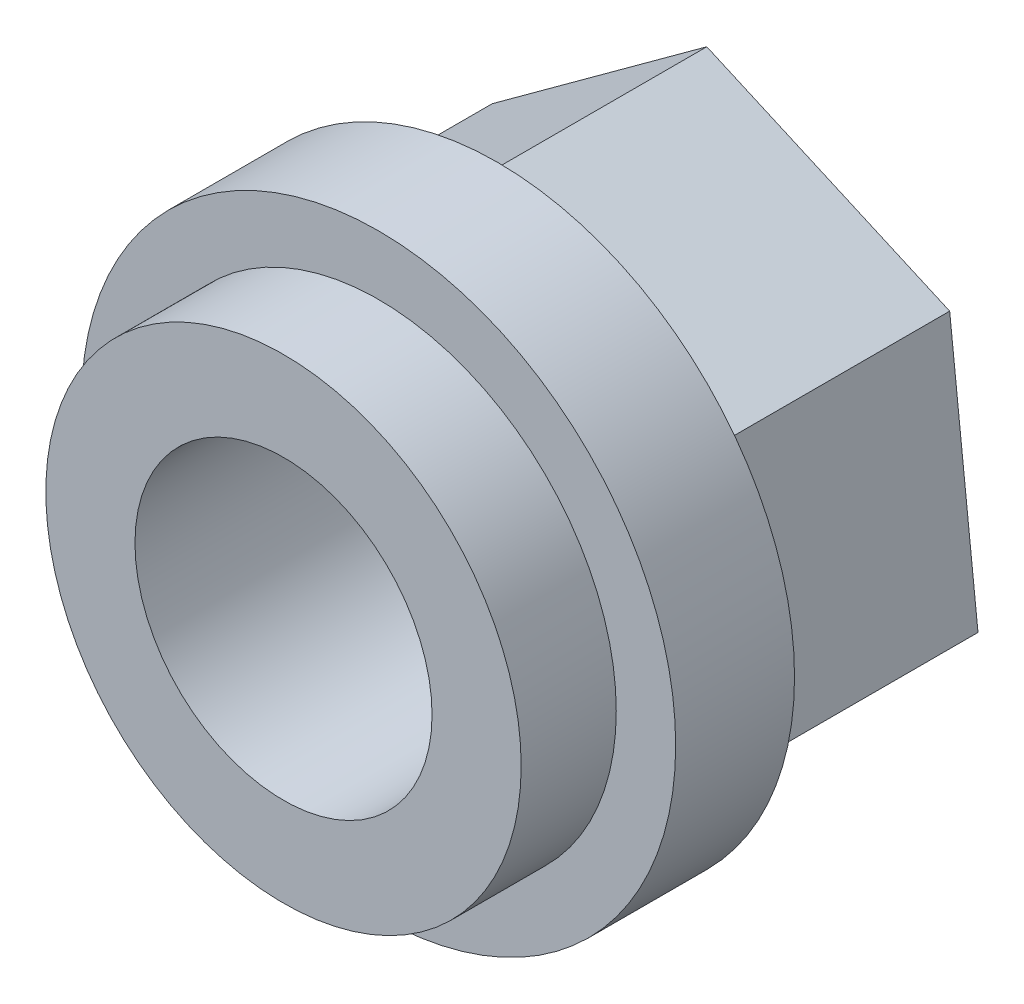
ISO-10303-21;
HEADER;
FILE_DESCRIPTION(('STEP AP214'),'2;1');
FILE_NAME('part.step','',(''),(''),'','','');
FILE_SCHEMA(('AUTOMOTIVE_DESIGN { 1 0 10303 214 1 1 1 1 }'));
ENDSEC;
DATA;
#1=APPLICATION_CONTEXT('core data for automotive mechanical design processes');
#2=APPLICATION_PROTOCOL_DEFINITION('international standard','automotive_design',2000,#1);
#3=PRODUCT_CONTEXT('',#1,'mechanical');
#4=PRODUCT('Part','Part','',(#3));
#5=PRODUCT_RELATED_PRODUCT_CATEGORY('part','',(#4));
#6=PRODUCT_DEFINITION_FORMATION('','',#4);
#7=PRODUCT_DEFINITION_CONTEXT('part definition',#1,'design');
#8=PRODUCT_DEFINITION('design','',#6,#7);
#9=PRODUCT_DEFINITION_SHAPE('','',#8);
#10=(LENGTH_UNIT() NAMED_UNIT(*) SI_UNIT(.MILLI.,.METRE.));
#11=(NAMED_UNIT(*) PLANE_ANGLE_UNIT() SI_UNIT($,.RADIAN.));
#12=(NAMED_UNIT(*) SI_UNIT($,.STERADIAN.) SOLID_ANGLE_UNIT());
#13=UNCERTAINTY_MEASURE_WITH_UNIT(LENGTH_MEASURE(1.E-05),#10,'distance_accuracy_value','');
#14=(GEOMETRIC_REPRESENTATION_CONTEXT(3) GLOBAL_UNCERTAINTY_ASSIGNED_CONTEXT((#13)) GLOBAL_UNIT_ASSIGNED_CONTEXT((#10,
#11,#12)) REPRESENTATION_CONTEXT('',''));
#15=CARTESIAN_POINT('',(0.,0.,0.));
#16=DIRECTION('',(0.,0.,1.));
#17=DIRECTION('',(1.,0.,0.));
#18=AXIS2_PLACEMENT_3D('',#15,#16,#17);
#19=CARTESIAN_POINT('',(0.,0.,0.));
#20=DIRECTION('',(0.,0.,1.));
#21=DIRECTION('',(1.,0.,0.));
#22=AXIS2_PLACEMENT_3D('',#19,#20,#21);
#23=PLANE('',#22);
#24=CARTESIAN_POINT('',(0.,0.,0.));
#25=DIRECTION('',(0.,0.,1.));
#26=DIRECTION('',(1.,0.,0.));
#27=AXIS2_PLACEMENT_3D('',#24,#25,#26);
#28=CIRCLE('',#27,25.);
#29=CARTESIAN_POINT('',(25.,0.,0.));
#30=VERTEX_POINT('',#29);
#31=EDGE_CURVE('E46',#30,#30,#28,.T.);
#32=ORIENTED_EDGE('',*,*,#31,.F.);
#33=EDGE_LOOP('',(#32));
#34=FACE_BOUND('',#33,.T.);
#35=DIRECTION('',(0.106649643438628,-0.994296662749309,0.));
#36=VECTOR('',#35,1.);
#37=CARTESIAN_POINT('',(18.0534867210994,13.175555316386,0.));
#38=LINE('',#37,#36);
#39=CARTESIAN_POINT('',(18.0534867210994,13.175555316386,0.));
#40=VERTEX_POINT('',#39);
#41=CARTESIAN_POINT('',(20.4371089735071,-9.04700046916413,0.));
#42=VERTEX_POINT('',#41);
#43=EDGE_CURVE('E59',#40,#42,#38,.T.);
#44=ORIENTED_EDGE('',*,*,#43,.F.);
#45=DIRECTION('',(0.914410990558305,-0.40478703085225,0.));
#46=VECTOR('',#45,1.);
#47=CARTESIAN_POINT('',(-2.38362225240768,22.2225557855501,0.));
#48=LINE('',#47,#46);
#49=CARTESIAN_POINT('',(-2.38362225240768,22.2225557855501,0.));
#50=VERTEX_POINT('',#49);
#51=EDGE_CURVE('E63',#50,#40,#48,.T.);
#52=ORIENTED_EDGE('',*,*,#51,.F.);
#53=DIRECTION('',(0.807761347119676,0.589509631897059,0.));
#54=VECTOR('',#53,1.);
#55=CARTESIAN_POINT('',(-20.4371089735071,9.04700046916413,0.));
#56=LINE('',#55,#54);
#57=CARTESIAN_POINT('',(-20.4371089735071,9.04700046916413,0.));
#58=VERTEX_POINT('',#57);
#59=EDGE_CURVE('E203',#58,#50,#56,.T.);
#60=ORIENTED_EDGE('',*,*,#59,.F.);
#61=DIRECTION('',(-0.106649643438628,0.994296662749309,0.));
#62=VECTOR('',#61,1.);
#63=CARTESIAN_POINT('',(-18.0534867210994,-13.175555316386,0.));
#64=LINE('',#63,#62);
#65=CARTESIAN_POINT('',(-18.0534867210994,-13.175555316386,0.));
#66=VERTEX_POINT('',#65);
#67=EDGE_CURVE('E200',#66,#58,#64,.T.);
#68=ORIENTED_EDGE('',*,*,#67,.F.);
#69=DIRECTION('',(-0.914410990558305,0.40478703085225,0.));
#70=VECTOR('',#69,1.);
#71=CARTESIAN_POINT('',(2.38362225240767,-22.2225557855501,0.));
#72=LINE('',#71,#70);
#73=CARTESIAN_POINT('',(2.38362225240767,-22.2225557855501,0.));
#74=VERTEX_POINT('',#73);
#75=EDGE_CURVE('E197',#74,#66,#72,.T.);
#76=ORIENTED_EDGE('',*,*,#75,.F.);
#77=DIRECTION('',(-0.807761347119676,-0.589509631897059,0.));
#78=VECTOR('',#77,1.);
#79=CARTESIAN_POINT('',(20.4371089735071,-9.04700046916413,0.));
#80=LINE('',#79,#78);
#81=EDGE_CURVE('E195',#42,#74,#80,.T.);
#82=ORIENTED_EDGE('',*,*,#81,.F.);
#83=EDGE_LOOP('',(#44,#52,#60,#68,#76,#82));
#84=FACE_BOUND('',#83,.T.);
#85=ADVANCED_FACE('F42',(#34,#84),#23,.F.);
#86=CARTESIAN_POINT('',(0.,0.,10.));
#87=DIRECTION('',(0.,0.,-1.));
#88=DIRECTION('',(-1.,0.,0.));
#89=AXIS2_PLACEMENT_3D('',#86,#87,#88);
#90=CYLINDRICAL_SURFACE('',#89,25.);
#91=CARTESIAN_POINT('',(0.,0.,10.));
#92=DIRECTION('',(0.,0.,1.));
#93=DIRECTION('',(1.,0.,0.));
#94=AXIS2_PLACEMENT_3D('',#91,#92,#93);
#95=CIRCLE('',#94,25.);
#96=CARTESIAN_POINT('',(25.,0.,10.));
#97=VERTEX_POINT('',#96);
#98=EDGE_CURVE('E51',#97,#97,#95,.T.);
#99=ORIENTED_EDGE('',*,*,#98,.F.);
#100=EDGE_LOOP('',(#99));
#101=FACE_BOUND('',#100,.T.);
#102=ORIENTED_EDGE('',*,*,#31,.T.);
#103=EDGE_LOOP('',(#102));
#104=FACE_BOUND('',#103,.T.);
#105=ADVANCED_FACE('F44',(#101,#104),#90,.T.);
#106=CARTESIAN_POINT('',(0.,0.,10.));
#107=DIRECTION('',(0.,0.,1.));
#108=DIRECTION('',(1.,0.,0.));
#109=AXIS2_PLACEMENT_3D('',#106,#107,#108);
#110=PLANE('',#109);
#111=CARTESIAN_POINT('',(0.,0.,10.));
#112=DIRECTION('',(0.,0.,1.));
#113=DIRECTION('',(1.,0.,0.));
#114=AXIS2_PLACEMENT_3D('',#111,#112,#113);
#115=CIRCLE('',#114,20.);
#116=CARTESIAN_POINT('',(20.,0.,10.));
#117=VERTEX_POINT('',#116);
#118=EDGE_CURVE('E11',#117,#117,#115,.T.);
#119=ORIENTED_EDGE('',*,*,#118,.F.);
#120=EDGE_LOOP('',(#119));
#121=FACE_BOUND('',#120,.T.);
#122=ORIENTED_EDGE('',*,*,#98,.T.);
#123=EDGE_LOOP('',(#122));
#124=FACE_BOUND('',#123,.T.);
#125=ADVANCED_FACE('F135',(#121,#124),#110,.T.);
#126=CARTESIAN_POINT('',(0.,0.,18.));
#127=DIRECTION('',(0.,0.,-1.));
#128=DIRECTION('',(-1.,0.,0.));
#129=AXIS2_PLACEMENT_3D('',#126,#127,#128);
#130=CYLINDRICAL_SURFACE('',#129,20.);
#131=CARTESIAN_POINT('',(0.,0.,18.));
#132=DIRECTION('',(0.,0.,1.));
#133=DIRECTION('',(1.,0.,0.));
#134=AXIS2_PLACEMENT_3D('',#131,#132,#133);
#135=CIRCLE('',#134,20.);
#136=CARTESIAN_POINT('',(20.,0.,18.));
#137=VERTEX_POINT('',#136);
#138=EDGE_CURVE('E117',#137,#137,#135,.T.);
#139=ORIENTED_EDGE('',*,*,#138,.F.);
#140=EDGE_LOOP('',(#139));
#141=FACE_BOUND('',#140,.T.);
#142=ORIENTED_EDGE('',*,*,#118,.T.);
#143=EDGE_LOOP('',(#142));
#144=FACE_BOUND('',#143,.T.);
#145=ADVANCED_FACE('F140',(#141,#144),#130,.T.);
#146=CARTESIAN_POINT('',(0.,0.,18.));
#147=DIRECTION('',(0.,0.,1.));
#148=DIRECTION('',(1.,0.,0.));
#149=AXIS2_PLACEMENT_3D('',#146,#147,#148);
#150=PLANE('',#149);
#151=CARTESIAN_POINT('',(0.,0.,18.));
#152=DIRECTION('',(0.,0.,-1.));
#153=DIRECTION('',(-1.,0.,0.));
#154=AXIS2_PLACEMENT_3D('',#151,#152,#153);
#155=CIRCLE('',#154,12.5);
#156=CARTESIAN_POINT('',(-12.5,0.,18.));
#157=VERTEX_POINT('',#156);
#158=EDGE_CURVE('E180',#157,#157,#155,.T.);
#159=ORIENTED_EDGE('',*,*,#158,.T.);
#160=EDGE_LOOP('',(#159));
#161=FACE_BOUND('',#160,.T.);
#162=ORIENTED_EDGE('',*,*,#138,.T.);
#163=EDGE_LOOP('',(#162));
#164=FACE_BOUND('',#163,.T.);
#165=ADVANCED_FACE('F144',(#161,#164),#150,.T.);
#166=CARTESIAN_POINT('',(18.0534867210994,13.175555316386,-20.));
#167=DIRECTION('',(-0.994296662749309,-0.106649643438628,0.));
#168=DIRECTION('',(0.106649643438628,-0.994296662749309,0.));
#169=AXIS2_PLACEMENT_3D('',#166,#167,#168);
#170=PLANE('',#169);
#171=ORIENTED_EDGE('',*,*,#43,.T.);
#172=DIRECTION('',(0.,0.,1.));
#173=VECTOR('',#172,1.);
#174=CARTESIAN_POINT('',(20.4371089735071,-9.04700046916413,-20.));
#175=LINE('',#174,#173);
#176=CARTESIAN_POINT('',(20.4371089735071,-9.04700046916413,-20.));
#177=VERTEX_POINT('',#176);
#178=EDGE_CURVE('E100',#177,#42,#175,.T.);
#179=ORIENTED_EDGE('',*,*,#178,.F.);
#180=DIRECTION('',(0.106649643438628,-0.994296662749309,0.));
#181=VECTOR('',#180,1.);
#182=CARTESIAN_POINT('',(18.0534867210994,13.175555316386,-20.));
#183=LINE('',#182,#181);
#184=CARTESIAN_POINT('',(18.0534867210994,13.175555316386,-20.));
#185=VERTEX_POINT('',#184);
#186=EDGE_CURVE('E106',#185,#177,#183,.T.);
#187=ORIENTED_EDGE('',*,*,#186,.F.);
#188=DIRECTION('',(0.,0.,1.));
#189=VECTOR('',#188,1.);
#190=CARTESIAN_POINT('',(18.0534867210994,13.175555316386,-20.));
#191=LINE('',#190,#189);
#192=EDGE_CURVE('E193',#185,#40,#191,.T.);
#193=ORIENTED_EDGE('',*,*,#192,.T.);
#194=EDGE_LOOP('',(#171,#179,#187,#193));
#195=FACE_BOUND('',#194,.T.);
#196=ADVANCED_FACE('F116',(#195),#170,.F.);
#197=CARTESIAN_POINT('',(20.4371089735071,-9.04700046916413,-20.));
#198=DIRECTION('',(-0.589509631897059,0.807761347119676,0.));
#199=DIRECTION('',(-0.807761347119676,-0.589509631897059,0.));
#200=AXIS2_PLACEMENT_3D('',#197,#198,#199);
#201=PLANE('',#200);
#202=ORIENTED_EDGE('',*,*,#81,.T.);
#203=DIRECTION('',(0.,0.,1.));
#204=VECTOR('',#203,1.);
#205=CARTESIAN_POINT('',(2.38362225240767,-22.2225557855501,-20.));
#206=LINE('',#205,#204);
#207=CARTESIAN_POINT('',(2.38362225240767,-22.2225557855501,-20.));
#208=VERTEX_POINT('',#207);
#209=EDGE_CURVE('E102',#208,#74,#206,.T.);
#210=ORIENTED_EDGE('',*,*,#209,.F.);
#211=DIRECTION('',(-0.807761347119676,-0.589509631897059,0.));
#212=VECTOR('',#211,1.);
#213=CARTESIAN_POINT('',(20.4371089735071,-9.04700046916413,-20.));
#214=LINE('',#213,#212);
#215=EDGE_CURVE('E95',#177,#208,#214,.T.);
#216=ORIENTED_EDGE('',*,*,#215,.F.);
#217=ORIENTED_EDGE('',*,*,#178,.T.);
#218=EDGE_LOOP('',(#202,#210,#216,#217));
#219=FACE_BOUND('',#218,.T.);
#220=ADVANCED_FACE('F98',(#219),#201,.F.);
#221=CARTESIAN_POINT('',(2.38362225240767,-22.2225557855501,-20.));
#222=DIRECTION('',(0.40478703085225,0.914410990558305,0.));
#223=DIRECTION('',(-0.914410990558305,0.40478703085225,0.));
#224=AXIS2_PLACEMENT_3D('',#221,#222,#223);
#225=PLANE('',#224);
#226=ORIENTED_EDGE('',*,*,#75,.T.);
#227=DIRECTION('',(0.,0.,1.));
#228=VECTOR('',#227,1.);
#229=CARTESIAN_POINT('',(-18.0534867210994,-13.175555316386,-20.));
#230=LINE('',#229,#228);
#231=CARTESIAN_POINT('',(-18.0534867210994,-13.175555316386,-20.));
#232=VERTEX_POINT('',#231);
#233=EDGE_CURVE('E121',#232,#66,#230,.T.);
#234=ORIENTED_EDGE('',*,*,#233,.F.);
#235=DIRECTION('',(-0.914410990558305,0.40478703085225,0.));
#236=VECTOR('',#235,1.);
#237=CARTESIAN_POINT('',(2.38362225240767,-22.2225557855501,-20.));
#238=LINE('',#237,#236);
#239=EDGE_CURVE('E105',#208,#232,#238,.T.);
#240=ORIENTED_EDGE('',*,*,#239,.F.);
#241=ORIENTED_EDGE('',*,*,#209,.T.);
#242=EDGE_LOOP('',(#226,#234,#240,#241));
#243=FACE_BOUND('',#242,.T.);
#244=ADVANCED_FACE('F153',(#243),#225,.F.);
#245=CARTESIAN_POINT('',(-18.0534867210994,-13.175555316386,-20.));
#246=DIRECTION('',(0.994296662749309,0.106649643438628,0.));
#247=DIRECTION('',(-0.106649643438628,0.994296662749309,0.));
#248=AXIS2_PLACEMENT_3D('',#245,#246,#247);
#249=PLANE('',#248);
#250=ORIENTED_EDGE('',*,*,#67,.T.);
#251=DIRECTION('',(0.,0.,1.));
#252=VECTOR('',#251,1.);
#253=CARTESIAN_POINT('',(-20.4371089735071,9.04700046916413,-20.));
#254=LINE('',#253,#252);
#255=CARTESIAN_POINT('',(-20.4371089735071,9.04700046916413,-20.));
#256=VERTEX_POINT('',#255);
#257=EDGE_CURVE('E210',#256,#58,#254,.T.);
#258=ORIENTED_EDGE('',*,*,#257,.F.);
#259=DIRECTION('',(-0.106649643438628,0.994296662749309,0.));
#260=VECTOR('',#259,1.);
#261=CARTESIAN_POINT('',(-18.0534867210994,-13.175555316386,-20.));
#262=LINE('',#261,#260);
#263=EDGE_CURVE('E188',#232,#256,#262,.T.);
#264=ORIENTED_EDGE('',*,*,#263,.F.);
#265=ORIENTED_EDGE('',*,*,#233,.T.);
#266=EDGE_LOOP('',(#250,#258,#264,#265));
#267=FACE_BOUND('',#266,.T.);
#268=ADVANCED_FACE('F156',(#267),#249,.F.);
#269=CARTESIAN_POINT('',(-20.4371089735071,9.04700046916413,-20.));
#270=DIRECTION('',(0.589509631897059,-0.807761347119676,0.));
#271=DIRECTION('',(0.807761347119676,0.589509631897059,0.));
#272=AXIS2_PLACEMENT_3D('',#269,#270,#271);
#273=PLANE('',#272);
#274=ORIENTED_EDGE('',*,*,#59,.T.);
#275=DIRECTION('',(0.,0.,1.));
#276=VECTOR('',#275,1.);
#277=CARTESIAN_POINT('',(-2.38362225240768,22.2225557855501,-20.));
#278=LINE('',#277,#276);
#279=CARTESIAN_POINT('',(-2.38362225240768,22.2225557855501,-20.));
#280=VERTEX_POINT('',#279);
#281=EDGE_CURVE('E207',#280,#50,#278,.T.);
#282=ORIENTED_EDGE('',*,*,#281,.F.);
#283=DIRECTION('',(0.807761347119676,0.589509631897059,0.));
#284=VECTOR('',#283,1.);
#285=CARTESIAN_POINT('',(-20.4371089735071,9.04700046916413,-20.));
#286=LINE('',#285,#284);
#287=EDGE_CURVE('E190',#256,#280,#286,.T.);
#288=ORIENTED_EDGE('',*,*,#287,.F.);
#289=ORIENTED_EDGE('',*,*,#257,.T.);
#290=EDGE_LOOP('',(#274,#282,#288,#289));
#291=FACE_BOUND('',#290,.T.);
#292=ADVANCED_FACE('F160',(#291),#273,.F.);
#293=CARTESIAN_POINT('',(-2.38362225240768,22.2225557855501,-20.));
#294=DIRECTION('',(-0.40478703085225,-0.914410990558305,0.));
#295=DIRECTION('',(0.914410990558305,-0.40478703085225,0.));
#296=AXIS2_PLACEMENT_3D('',#293,#294,#295);
#297=PLANE('',#296);
#298=ORIENTED_EDGE('',*,*,#51,.T.);
#299=ORIENTED_EDGE('',*,*,#192,.F.);
#300=DIRECTION('',(0.914410990558305,-0.40478703085225,0.));
#301=VECTOR('',#300,1.);
#302=CARTESIAN_POINT('',(-2.38362225240768,22.2225557855501,-20.));
#303=LINE('',#302,#301);
#304=EDGE_CURVE('E111',#280,#185,#303,.T.);
#305=ORIENTED_EDGE('',*,*,#304,.F.);
#306=ORIENTED_EDGE('',*,*,#281,.T.);
#307=EDGE_LOOP('',(#298,#299,#305,#306));
#308=FACE_BOUND('',#307,.T.);
#309=ADVANCED_FACE('F164',(#308),#297,.F.);
#310=CARTESIAN_POINT('',(0.,0.,-20.));
#311=DIRECTION('',(0.,0.,-1.));
#312=DIRECTION('',(-1.,0.,0.));
#313=AXIS2_PLACEMENT_3D('',#310,#311,#312);
#314=PLANE('',#313);
#315=CARTESIAN_POINT('',(0.,0.,-20.));
#316=DIRECTION('',(0.,0.,-1.));
#317=DIRECTION('',(-1.,0.,0.));
#318=AXIS2_PLACEMENT_3D('',#315,#316,#317);
#319=CIRCLE('',#318,12.5);
#320=CARTESIAN_POINT('',(-12.5,0.,-20.));
#321=VERTEX_POINT('',#320);
#322=EDGE_CURVE('E183',#321,#321,#319,.T.);
#323=ORIENTED_EDGE('',*,*,#322,.F.);
#324=EDGE_LOOP('',(#323));
#325=FACE_BOUND('',#324,.T.);
#326=ORIENTED_EDGE('',*,*,#186,.T.);
#327=ORIENTED_EDGE('',*,*,#215,.T.);
#328=ORIENTED_EDGE('',*,*,#239,.T.);
#329=ORIENTED_EDGE('',*,*,#263,.T.);
#330=ORIENTED_EDGE('',*,*,#287,.T.);
#331=ORIENTED_EDGE('',*,*,#304,.T.);
#332=EDGE_LOOP('',(#326,#327,#328,#329,#330,#331));
#333=FACE_BOUND('',#332,.T.);
#334=ADVANCED_FACE('F109',(#325,#333),#314,.T.);
#335=CARTESIAN_POINT('',(0.,0.,18.));
#336=DIRECTION('',(0.,0.,-1.));
#337=DIRECTION('',(-1.,0.,0.));
#338=AXIS2_PLACEMENT_3D('',#335,#336,#337);
#339=CYLINDRICAL_SURFACE('',#338,12.5);
#340=ORIENTED_EDGE('',*,*,#158,.F.);
#341=EDGE_LOOP('',(#340));
#342=FACE_BOUND('',#341,.T.);
#343=ORIENTED_EDGE('',*,*,#322,.T.);
#344=EDGE_LOOP('',(#343));
#345=FACE_BOUND('',#344,.T.);
#346=ADVANCED_FACE('F171',(#342,#345),#339,.F.);
#347=CLOSED_SHELL('',(#85,#105,#125,#145,#165,#196,#220,#244,#268,#292,#309,#334,#346));
#348=MANIFOLD_SOLID_BREP('B2',#347);
#349=ADVANCED_BREP_SHAPE_REPRESENTATION('',(#18,#348),#14);
#350=SHAPE_DEFINITION_REPRESENTATION(#9,#349);
ENDSEC;
END-ISO-10303-21;
